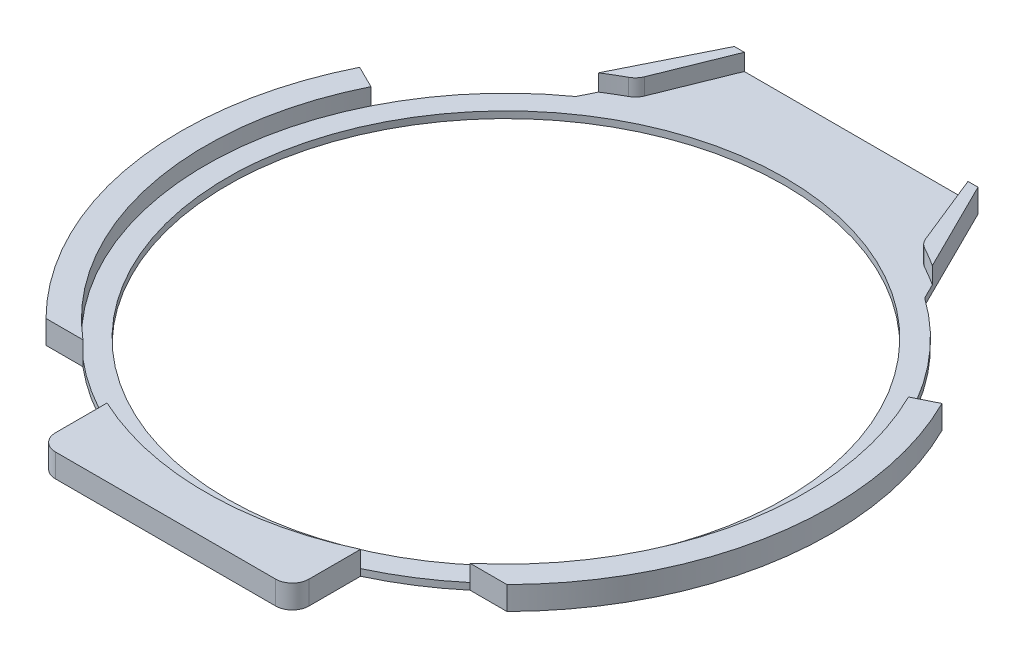
ISO-10303-21;
HEADER;
FILE_DESCRIPTION(('STEP AP214'),'2;1');
FILE_NAME('part.step','',(''),(''),'','','');
FILE_SCHEMA(('AUTOMOTIVE_DESIGN { 1 0 10303 214 1 1 1 1 }'));
ENDSEC;
DATA;
#1=APPLICATION_CONTEXT('core data for automotive mechanical design processes');
#2=APPLICATION_PROTOCOL_DEFINITION('international standard','automotive_design',2000,#1);
#3=PRODUCT_CONTEXT('',#1,'mechanical');
#4=PRODUCT('Part','Part','',(#3));
#5=PRODUCT_RELATED_PRODUCT_CATEGORY('part','',(#4));
#6=PRODUCT_DEFINITION_FORMATION('','',#4);
#7=PRODUCT_DEFINITION_CONTEXT('part definition',#1,'design');
#8=PRODUCT_DEFINITION('design','',#6,#7);
#9=PRODUCT_DEFINITION_SHAPE('','',#8);
#10=(LENGTH_UNIT() NAMED_UNIT(*) SI_UNIT(.MILLI.,.METRE.));
#11=(NAMED_UNIT(*) PLANE_ANGLE_UNIT() SI_UNIT($,.RADIAN.));
#12=(NAMED_UNIT(*) SI_UNIT($,.STERADIAN.) SOLID_ANGLE_UNIT());
#13=UNCERTAINTY_MEASURE_WITH_UNIT(LENGTH_MEASURE(1.E-05),#10,'distance_accuracy_value','');
#14=(GEOMETRIC_REPRESENTATION_CONTEXT(3) GLOBAL_UNCERTAINTY_ASSIGNED_CONTEXT((#13)) GLOBAL_UNIT_ASSIGNED_CONTEXT((#10,
#11,#12)) REPRESENTATION_CONTEXT('',''));
#15=CARTESIAN_POINT('',(0.,0.,0.));
#16=DIRECTION('',(0.,0.,1.));
#17=DIRECTION('',(1.,0.,0.));
#18=AXIS2_PLACEMENT_3D('',#15,#16,#17);
#19=CARTESIAN_POINT('',(0.,0.4,0.));
#20=DIRECTION('',(0.,-1.,0.));
#21=DIRECTION('',(0.,0.,-1.));
#22=AXIS2_PLACEMENT_3D('',#19,#20,#21);
#23=PLANE('',#22);
#24=CARTESIAN_POINT('',(0.,0.4,0.));
#25=DIRECTION('',(0.,1.,0.));
#26=DIRECTION('',(0.,0.,1.));
#27=AXIS2_PLACEMENT_3D('',#24,#25,#26);
#28=CIRCLE('',#27,16.7);
#29=CARTESIAN_POINT('',(0.,0.4,16.7));
#30=VERTEX_POINT('',#29);
#31=EDGE_CURVE('E337',#30,#30,#28,.T.);
#32=ORIENTED_EDGE('',*,*,#31,.F.);
#33=EDGE_LOOP('',(#32));
#34=FACE_BOUND('',#33,.T.);
#35=CARTESIAN_POINT('',(0.,0.4,0.));
#36=DIRECTION('',(0.,-1.,0.));
#37=DIRECTION('',(0.,0.,1.));
#38=AXIS2_PLACEMENT_3D('',#35,#36,#37);
#39=CIRCLE('',#38,18.);
#40=CARTESIAN_POINT('',(7.60000000000001,0.4,16.3168624434969));
#41=VERTEX_POINT('',#40);
#42=CARTESIAN_POINT('',(-7.6,0.4,16.3168624434969));
#43=VERTEX_POINT('',#42);
#44=EDGE_CURVE('E247',#41,#43,#39,.T.);
#45=ORIENTED_EDGE('',*,*,#44,.F.);
#46=CARTESIAN_POINT('',(0.,0.4,0.));
#47=DIRECTION('',(0.,1.,0.));
#48=DIRECTION('',(0.,0.,-1.));
#49=AXIS2_PLACEMENT_3D('',#46,#47,#48);
#50=CIRCLE('',#49,18.);
#51=CARTESIAN_POINT('',(11.606251108545,0.4,13.7584495930827));
#52=VERTEX_POINT('',#51);
#53=EDGE_CURVE('E357',#41,#52,#50,.T.);
#54=ORIENTED_EDGE('',*,*,#53,.T.);
#55=CARTESIAN_POINT('',(0.,0.4,0.));
#56=DIRECTION('',(0.,-1.,0.));
#57=DIRECTION('',(0.,0.,-1.));
#58=AXIS2_PLACEMENT_3D('',#55,#56,#57);
#59=CIRCLE('',#58,18.);
#60=CARTESIAN_POINT('',(16.1144925401185,0.4,-8.02017020857192));
#61=VERTEX_POINT('',#60);
#62=EDGE_CURVE('E251',#61,#52,#59,.T.);
#63=ORIENTED_EDGE('',*,*,#62,.F.);
#64=CARTESIAN_POINT('',(0.,0.4,0.));
#65=DIRECTION('',(0.,1.,0.));
#66=DIRECTION('',(0.,0.,-1.));
#67=AXIS2_PLACEMENT_3D('',#64,#65,#66);
#68=CIRCLE('',#67,18.);
#69=CARTESIAN_POINT('',(10.4617771668976,0.4,-14.6475669826146));
#70=VERTEX_POINT('',#69);
#71=EDGE_CURVE('E359',#61,#70,#68,.T.);
#72=ORIENTED_EDGE('',*,*,#71,.T.);
#73=DIRECTION('',(-0.44493731127233,0.,-0.895561717045648));
#74=VECTOR('',#73,1.);
#75=CARTESIAN_POINT('',(10.0092280551251,0.4,-15.5584495930827));
#76=LINE('',#75,#74);
#77=CARTESIAN_POINT('',(10.0092280551251,0.4,-15.5584495930827));
#78=VERTEX_POINT('',#77);
#79=EDGE_CURVE('E343',#70,#78,#76,.T.);
#80=ORIENTED_EDGE('',*,*,#79,.T.);
#81=CARTESIAN_POINT('',(0.,0.4,0.));
#82=DIRECTION('',(0.,-1.,0.));
#83=DIRECTION('',(0.,0.,1.));
#84=AXIS2_PLACEMENT_3D('',#81,#82,#83);
#85=CIRCLE('',#84,18.5);
#86=CARTESIAN_POINT('',(8.87292935243815,0.4,-16.2333337520868));
#87=VERTEX_POINT('',#86);
#88=EDGE_CURVE('E281',#87,#78,#85,.T.);
#89=ORIENTED_EDGE('',*,*,#88,.F.);
#90=CARTESIAN_POINT('',(9.35254715527264,0.4,-17.1108112521996));
#91=DIRECTION('',(0.,-1.,0.));
#92=DIRECTION('',(0.,0.,-1.));
#93=AXIS2_PLACEMENT_3D('',#90,#91,#92);
#94=CIRCLE('',#93,1.);
#95=CARTESIAN_POINT('',(8.42513285626354,0.4,-16.7367755346626));
#96=VERTEX_POINT('',#95);
#97=EDGE_CURVE('E41',#87,#96,#94,.T.);
#98=ORIENTED_EDGE('',*,*,#97,.T.);
#99=DIRECTION('',(0.374035717537045,0.,0.927414299009104));
#100=VECTOR('',#99,1.);
#101=CARTESIAN_POINT('',(8.56095789032979,0.4,-16.4));
#102=LINE('',#101,#100);
#103=CARTESIAN_POINT('',(6.70573061756858,0.4,-21.));
#104=VERTEX_POINT('',#103);
#105=EDGE_CURVE('E276',#104,#96,#102,.T.);
#106=ORIENTED_EDGE('',*,*,#105,.F.);
#107=DIRECTION('',(-1.,0.,0.));
#108=VECTOR('',#107,1.);
#109=CARTESIAN_POINT('',(-7.30573061756858,0.4,-21.));
#110=LINE('',#109,#108);
#111=CARTESIAN_POINT('',(-6.70573061756858,0.4,-21.));
#112=VERTEX_POINT('',#111);
#113=EDGE_CURVE('E346',#104,#112,#110,.T.);
#114=ORIENTED_EDGE('',*,*,#113,.T.);
#115=DIRECTION('',(0.374035717537046,0.,-0.927414299009104));
#116=VECTOR('',#115,1.);
#117=CARTESIAN_POINT('',(-8.5609578903298,0.4,-16.4));
#118=LINE('',#117,#116);
#119=CARTESIAN_POINT('',(-8.42513285626354,0.4,-16.7367755346626));
#120=VERTEX_POINT('',#119);
#121=EDGE_CURVE('E301',#120,#112,#118,.T.);
#122=ORIENTED_EDGE('',*,*,#121,.F.);
#123=CARTESIAN_POINT('',(-9.35254715527264,0.4,-17.1108112521996));
#124=DIRECTION('',(0.,-1.,0.));
#125=DIRECTION('',(0.,0.,-1.));
#126=AXIS2_PLACEMENT_3D('',#123,#124,#125);
#127=CIRCLE('',#126,1.);
#128=CARTESIAN_POINT('',(-8.87292935243815,0.4,-16.2333337520868));
#129=VERTEX_POINT('',#128);
#130=EDGE_CURVE('E11',#120,#129,#127,.T.);
#131=ORIENTED_EDGE('',*,*,#130,.T.);
#132=CARTESIAN_POINT('',(0.,0.4,0.));
#133=DIRECTION('',(0.,-1.,0.));
#134=DIRECTION('',(0.,0.,-1.));
#135=AXIS2_PLACEMENT_3D('',#132,#133,#134);
#136=CIRCLE('',#135,18.5);
#137=CARTESIAN_POINT('',(-10.0092280551251,0.4,-15.5584495930827));
#138=VERTEX_POINT('',#137);
#139=EDGE_CURVE('E297',#138,#129,#136,.T.);
#140=ORIENTED_EDGE('',*,*,#139,.F.);
#141=DIRECTION('',(-0.444937311272332,0.,0.895561717045647));
#142=VECTOR('',#141,1.);
#143=CARTESIAN_POINT('',(-7.30573061756858,0.4,-21.));
#144=LINE('',#143,#142);
#145=CARTESIAN_POINT('',(-10.4617771668976,0.4,-14.6475669826146));
#146=VERTEX_POINT('',#145);
#147=EDGE_CURVE('E350',#138,#146,#144,.T.);
#148=ORIENTED_EDGE('',*,*,#147,.T.);
#149=CARTESIAN_POINT('',(0.,0.4,0.));
#150=DIRECTION('',(0.,1.,0.));
#151=DIRECTION('',(0.,0.,1.));
#152=AXIS2_PLACEMENT_3D('',#149,#150,#151);
#153=CIRCLE('',#152,18.);
#154=CARTESIAN_POINT('',(-16.1144925401185,0.4,-8.02017020857191));
#155=VERTEX_POINT('',#154);
#156=EDGE_CURVE('E352',#146,#155,#153,.T.);
#157=ORIENTED_EDGE('',*,*,#156,.T.);
#158=CARTESIAN_POINT('',(0.,0.4,0.));
#159=DIRECTION('',(0.,-1.,0.));
#160=DIRECTION('',(0.,0.,1.));
#161=AXIS2_PLACEMENT_3D('',#158,#159,#160);
#162=CIRCLE('',#161,18.);
#163=CARTESIAN_POINT('',(-11.606251108545,0.4,13.7584495930827));
#164=VERTEX_POINT('',#163);
#165=EDGE_CURVE('E316',#164,#155,#162,.T.);
#166=ORIENTED_EDGE('',*,*,#165,.F.);
#167=CARTESIAN_POINT('',(0.,0.4,0.));
#168=DIRECTION('',(0.,1.,0.));
#169=DIRECTION('',(0.,0.,1.));
#170=AXIS2_PLACEMENT_3D('',#167,#168,#169);
#171=CIRCLE('',#170,18.);
#172=EDGE_CURVE('E355',#164,#43,#171,.T.);
#173=ORIENTED_EDGE('',*,*,#172,.T.);
#174=EDGE_LOOP('',(#45,#54,#63,#72,#80,#89,#98,#106,#114,#122,#131,#140,#148,#157,#166,#173));
#175=FACE_BOUND('',#174,.T.);
#176=ADVANCED_FACE('F33',(#34,#175),#23,.F.);
#177=CARTESIAN_POINT('',(0.,0.,0.));
#178=DIRECTION('',(0.,-1.,0.));
#179=DIRECTION('',(0.,0.,-1.));
#180=AXIS2_PLACEMENT_3D('',#177,#178,#179);
#181=PLANE('',#180);
#182=DIRECTION('',(0.,0.,-1.));
#183=VECTOR('',#182,1.);
#184=CARTESIAN_POINT('',(7.6,0.,20.4076999462));
#185=LINE('',#184,#183);
#186=CARTESIAN_POINT('',(7.6,0.,19.4076999462));
#187=VERTEX_POINT('',#186);
#188=CARTESIAN_POINT('',(7.6,0.,16.3168624434969));
#189=VERTEX_POINT('',#188);
#190=EDGE_CURVE('E383',#187,#189,#185,.T.);
#191=ORIENTED_EDGE('',*,*,#190,.F.);
#192=CARTESIAN_POINT('',(6.6,0.,19.4076999462));
#193=DIRECTION('',(0.,-1.,0.));
#194=DIRECTION('',(0.,0.,-1.));
#195=AXIS2_PLACEMENT_3D('',#192,#193,#194);
#196=CIRCLE('',#195,1.);
#197=CARTESIAN_POINT('',(6.6,0.,20.4076999462));
#198=VERTEX_POINT('',#197);
#199=EDGE_CURVE('E440',#187,#198,#196,.T.);
#200=ORIENTED_EDGE('',*,*,#199,.T.);
#201=DIRECTION('',(1.,0.,0.));
#202=VECTOR('',#201,1.);
#203=CARTESIAN_POINT('',(7.6,0.,20.4076999462));
#204=LINE('',#203,#202);
#205=CARTESIAN_POINT('',(-6.59999999999999,0.,20.4076999462));
#206=VERTEX_POINT('',#205);
#207=EDGE_CURVE('E380',#206,#198,#204,.T.);
#208=ORIENTED_EDGE('',*,*,#207,.F.);
#209=CARTESIAN_POINT('',(-6.59999999999999,0.,19.4076999462));
#210=DIRECTION('',(0.,-1.,0.));
#211=DIRECTION('',(0.,0.,-1.));
#212=AXIS2_PLACEMENT_3D('',#209,#210,#211);
#213=CIRCLE('',#212,1.);
#214=CARTESIAN_POINT('',(-7.6,0.,19.4076999462));
#215=VERTEX_POINT('',#214);
#216=EDGE_CURVE('E438',#206,#215,#213,.T.);
#217=ORIENTED_EDGE('',*,*,#216,.T.);
#218=DIRECTION('',(0.,0.,1.));
#219=VECTOR('',#218,1.);
#220=CARTESIAN_POINT('',(-7.6,0.,20.4076999462));
#221=LINE('',#220,#219);
#222=CARTESIAN_POINT('',(-7.6,0.,16.3168624434969));
#223=VERTEX_POINT('',#222);
#224=EDGE_CURVE('E378',#223,#215,#221,.T.);
#225=ORIENTED_EDGE('',*,*,#224,.F.);
#226=CARTESIAN_POINT('',(0.,0.,0.));
#227=DIRECTION('',(0.,1.,0.));
#228=DIRECTION('',(0.,0.,1.));
#229=AXIS2_PLACEMENT_3D('',#226,#227,#228);
#230=CIRCLE('',#229,18.);
#231=CARTESIAN_POINT('',(-11.606251108545,0.,13.7584495930827));
#232=VERTEX_POINT('',#231);
#233=EDGE_CURVE('E376',#232,#223,#230,.T.);
#234=ORIENTED_EDGE('',*,*,#233,.F.);
#235=DIRECTION('',(1.,0.,0.));
#236=VECTOR('',#235,1.);
#237=CARTESIAN_POINT('',(-13.8186491667819,0.,13.7584495930827));
#238=LINE('',#237,#236);
#239=CARTESIAN_POINT('',(-13.8186491667819,0.,13.7584495930827));
#240=VERTEX_POINT('',#239);
#241=EDGE_CURVE('E374',#240,#232,#238,.T.);
#242=ORIENTED_EDGE('',*,*,#241,.F.);
#243=CARTESIAN_POINT('',(0.,0.,0.));
#244=DIRECTION('',(0.,1.,0.));
#245=DIRECTION('',(0.,0.,1.));
#246=AXIS2_PLACEMENT_3D('',#243,#244,#245);
#247=CIRCLE('',#246,19.5);
#248=CARTESIAN_POINT('',(-17.4573669184617,0.,-8.6885177259529));
#249=VERTEX_POINT('',#248);
#250=EDGE_CURVE('E372',#249,#240,#247,.T.);
#251=ORIENTED_EDGE('',*,*,#250,.F.);
#252=DIRECTION('',(-0.895249585562142,0.,-0.445565011587325));
#253=VECTOR('',#252,1.);
#254=CARTESIAN_POINT('',(-16.1144925401185,0.,-8.02017020857191));
#255=LINE('',#254,#253);
#256=CARTESIAN_POINT('',(-16.1144925401185,0.,-8.02017020857191));
#257=VERTEX_POINT('',#256);
#258=EDGE_CURVE('E370',#257,#249,#255,.T.);
#259=ORIENTED_EDGE('',*,*,#258,.F.);
#260=CARTESIAN_POINT('',(0.,0.,0.));
#261=DIRECTION('',(0.,1.,0.));
#262=DIRECTION('',(0.,0.,1.));
#263=AXIS2_PLACEMENT_3D('',#260,#261,#262);
#264=CIRCLE('',#263,18.);
#265=CARTESIAN_POINT('',(-10.4617771668976,0.,-14.6475669826146));
#266=VERTEX_POINT('',#265);
#267=EDGE_CURVE('E368',#266,#257,#264,.T.);
#268=ORIENTED_EDGE('',*,*,#267,.F.);
#269=DIRECTION('',(-0.44493731127233,0.,0.895561717045648));
#270=VECTOR('',#269,1.);
#271=CARTESIAN_POINT('',(-10.0092280551251,0.,-15.5584495930827));
#272=LINE('',#271,#270);
#273=CARTESIAN_POINT('',(-7.30573061756858,0.,-21.));
#274=VERTEX_POINT('',#273);
#275=EDGE_CURVE('E366',#274,#266,#272,.T.);
#276=ORIENTED_EDGE('',*,*,#275,.F.);
#277=DIRECTION('',(-1.,0.,0.));
#278=VECTOR('',#277,1.);
#279=CARTESIAN_POINT('',(-7.30573061756858,0.,-21.));
#280=LINE('',#279,#278);
#281=CARTESIAN_POINT('',(7.30573061756858,0.,-21.));
#282=VERTEX_POINT('',#281);
#283=EDGE_CURVE('E363',#282,#274,#280,.T.);
#284=ORIENTED_EDGE('',*,*,#283,.F.);
#285=DIRECTION('',(-0.444937311272332,0.,-0.895561717045647));
#286=VECTOR('',#285,1.);
#287=CARTESIAN_POINT('',(7.30573061756858,0.,-21.));
#288=LINE('',#287,#286);
#289=CARTESIAN_POINT('',(10.4617771668976,0.,-14.6475669826146));
#290=VERTEX_POINT('',#289);
#291=EDGE_CURVE('E340',#290,#282,#288,.T.);
#292=ORIENTED_EDGE('',*,*,#291,.F.);
#293=CARTESIAN_POINT('',(0.,0.,0.));
#294=DIRECTION('',(0.,1.,0.));
#295=DIRECTION('',(0.,0.,-1.));
#296=AXIS2_PLACEMENT_3D('',#293,#294,#295);
#297=CIRCLE('',#296,18.);
#298=CARTESIAN_POINT('',(16.1144925401185,0.,-8.02017020857191));
#299=VERTEX_POINT('',#298);
#300=EDGE_CURVE('E347',#299,#290,#297,.T.);
#301=ORIENTED_EDGE('',*,*,#300,.F.);
#302=DIRECTION('',(-0.895249585562142,0.,0.445565011587325));
#303=VECTOR('',#302,1.);
#304=CARTESIAN_POINT('',(16.1144925401185,0.,-8.02017020857191));
#305=LINE('',#304,#303);
#306=CARTESIAN_POINT('',(17.4573669184617,0.,-8.6885177259529));
#307=VERTEX_POINT('',#306);
#308=EDGE_CURVE('E391',#307,#299,#305,.T.);
#309=ORIENTED_EDGE('',*,*,#308,.F.);
#310=CARTESIAN_POINT('',(0.,0.,0.));
#311=DIRECTION('',(0.,1.,0.));
#312=DIRECTION('',(0.,0.,-1.));
#313=AXIS2_PLACEMENT_3D('',#310,#311,#312);
#314=CIRCLE('',#313,19.5);
#315=CARTESIAN_POINT('',(13.8186491667819,0.,13.7584495930827));
#316=VERTEX_POINT('',#315);
#317=EDGE_CURVE('E389',#316,#307,#314,.T.);
#318=ORIENTED_EDGE('',*,*,#317,.F.);
#319=DIRECTION('',(1.,0.,0.));
#320=VECTOR('',#319,1.);
#321=CARTESIAN_POINT('',(13.8186491667819,0.,13.7584495930827));
#322=LINE('',#321,#320);
#323=CARTESIAN_POINT('',(11.606251108545,0.,13.7584495930827));
#324=VERTEX_POINT('',#323);
#325=EDGE_CURVE('E387',#324,#316,#322,.T.);
#326=ORIENTED_EDGE('',*,*,#325,.F.);
#327=CARTESIAN_POINT('',(0.,0.,0.));
#328=DIRECTION('',(0.,1.,0.));
#329=DIRECTION('',(0.,0.,-1.));
#330=AXIS2_PLACEMENT_3D('',#327,#328,#329);
#331=CIRCLE('',#330,18.);
#332=EDGE_CURVE('E385',#189,#324,#331,.T.);
#333=ORIENTED_EDGE('',*,*,#332,.F.);
#334=EDGE_LOOP('',(#191,#200,#208,#217,#225,#234,#242,#251,#259,#268,#276,#284,#292,#301,#309,
#318,#326,#333));
#335=FACE_BOUND('',#334,.T.);
#336=CARTESIAN_POINT('',(0.,0.,0.));
#337=DIRECTION('',(0.,1.,0.));
#338=DIRECTION('',(0.,0.,1.));
#339=AXIS2_PLACEMENT_3D('',#336,#337,#338);
#340=CIRCLE('',#339,16.7);
#341=CARTESIAN_POINT('',(0.,0.,16.7));
#342=VERTEX_POINT('',#341);
#343=EDGE_CURVE('E336',#342,#342,#340,.T.);
#344=ORIENTED_EDGE('',*,*,#343,.T.);
#345=EDGE_LOOP('',(#344));
#346=FACE_BOUND('',#345,.T.);
#347=ADVANCED_FACE('F536',(#335,#346),#181,.T.);
#348=CARTESIAN_POINT('',(7.30573061756858,0.4,-21.));
#349=DIRECTION('',(-0.895561717045647,0.,0.444937311272332));
#350=DIRECTION('',(0.444937311272332,0.,0.895561717045647));
#351=AXIS2_PLACEMENT_3D('',#348,#349,#350);
#352=PLANE('',#351);
#353=ORIENTED_EDGE('',*,*,#291,.T.);
#354=DIRECTION('',(0.,-1.,0.));
#355=VECTOR('',#354,1.);
#356=CARTESIAN_POINT('',(7.30573061756858,0.4,-21.));
#357=LINE('',#356,#355);
#358=CARTESIAN_POINT('',(7.30573061756858,1.4,-21.));
#359=VERTEX_POINT('',#358);
#360=EDGE_CURVE('E432',#359,#282,#357,.T.);
#361=ORIENTED_EDGE('',*,*,#360,.F.);
#362=DIRECTION('',(-0.444937311272332,0.,-0.895561717045647));
#363=VECTOR('',#362,1.);
#364=CARTESIAN_POINT('',(10.0092280551251,1.4,-15.5584495930827));
#365=LINE('',#364,#363);
#366=CARTESIAN_POINT('',(10.0092280551251,1.4,-15.5584495930827));
#367=VERTEX_POINT('',#366);
#368=EDGE_CURVE('E277',#367,#359,#365,.T.);
#369=ORIENTED_EDGE('',*,*,#368,.F.);
#370=DIRECTION('',(0.,-1.,0.));
#371=VECTOR('',#370,1.);
#372=CARTESIAN_POINT('',(10.0092280551251,1.4,-15.5584495930827));
#373=LINE('',#372,#371);
#374=EDGE_CURVE('E288',#367,#78,#373,.T.);
#375=ORIENTED_EDGE('',*,*,#374,.T.);
#376=ORIENTED_EDGE('',*,*,#79,.F.);
#377=DIRECTION('',(0.,-1.,0.));
#378=VECTOR('',#377,1.);
#379=CARTESIAN_POINT('',(10.4617771668976,0.4,-14.6475669826146));
#380=LINE('',#379,#378);
#381=EDGE_CURVE('E361',#70,#290,#380,.T.);
#382=ORIENTED_EDGE('',*,*,#381,.T.);
#383=EDGE_LOOP('',(#353,#361,#369,#375,#376,#382));
#384=FACE_BOUND('',#383,.T.);
#385=ADVANCED_FACE('F484',(#384),#352,.F.);
#386=CARTESIAN_POINT('',(-7.30573061756858,0.4,-21.));
#387=DIRECTION('',(0.,0.,1.));
#388=DIRECTION('',(1.,0.,0.));
#389=AXIS2_PLACEMENT_3D('',#386,#387,#388);
#390=PLANE('',#389);
#391=ORIENTED_EDGE('',*,*,#283,.T.);
#392=DIRECTION('',(0.,-1.,0.));
#393=VECTOR('',#392,1.);
#394=CARTESIAN_POINT('',(-7.30573061756858,0.4,-21.));
#395=LINE('',#394,#393);
#396=CARTESIAN_POINT('',(-7.30573061756858,1.4,-21.));
#397=VERTEX_POINT('',#396);
#398=EDGE_CURVE('E429',#397,#274,#395,.T.);
#399=ORIENTED_EDGE('',*,*,#398,.F.);
#400=DIRECTION('',(-1.,0.,0.));
#401=VECTOR('',#400,1.);
#402=CARTESIAN_POINT('',(-7.30573061756858,1.4,-21.));
#403=LINE('',#402,#401);
#404=CARTESIAN_POINT('',(-6.70573061756858,1.4,-21.));
#405=VERTEX_POINT('',#404);
#406=EDGE_CURVE('E303',#405,#397,#403,.T.);
#407=ORIENTED_EDGE('',*,*,#406,.F.);
#408=DIRECTION('',(0.,-1.,0.));
#409=VECTOR('',#408,1.);
#410=CARTESIAN_POINT('',(-6.70573061756858,1.4,-21.));
#411=LINE('',#410,#409);
#412=EDGE_CURVE('E313',#405,#112,#411,.T.);
#413=ORIENTED_EDGE('',*,*,#412,.T.);
#414=ORIENTED_EDGE('',*,*,#113,.F.);
#415=DIRECTION('',(0.,-1.,0.));
#416=VECTOR('',#415,1.);
#417=CARTESIAN_POINT('',(6.70573061756858,1.4,-21.));
#418=LINE('',#417,#416);
#419=CARTESIAN_POINT('',(6.70573061756858,1.4,-21.));
#420=VERTEX_POINT('',#419);
#421=EDGE_CURVE('E294',#420,#104,#418,.T.);
#422=ORIENTED_EDGE('',*,*,#421,.F.);
#423=DIRECTION('',(-1.,0.,0.));
#424=VECTOR('',#423,1.);
#425=CARTESIAN_POINT('',(6.70573061756858,1.4,-21.));
#426=LINE('',#425,#424);
#427=EDGE_CURVE('E280',#359,#420,#426,.T.);
#428=ORIENTED_EDGE('',*,*,#427,.F.);
#429=ORIENTED_EDGE('',*,*,#360,.T.);
#430=EDGE_LOOP('',(#391,#399,#407,#413,#414,#422,#428,#429));
#431=FACE_BOUND('',#430,.T.);
#432=ADVANCED_FACE('F487',(#431),#390,.F.);
#433=CARTESIAN_POINT('',(-10.0092280551251,0.4,-15.5584495930827));
#434=DIRECTION('',(0.895561717045648,0.,0.44493731127233));
#435=DIRECTION('',(0.44493731127233,0.,-0.895561717045648));
#436=AXIS2_PLACEMENT_3D('',#433,#434,#435);
#437=PLANE('',#436);
#438=ORIENTED_EDGE('',*,*,#275,.T.);
#439=DIRECTION('',(0.,-1.,0.));
#440=VECTOR('',#439,1.);
#441=CARTESIAN_POINT('',(-10.4617771668976,0.4,-14.6475669826146));
#442=LINE('',#441,#440);
#443=EDGE_CURVE('E426',#146,#266,#442,.T.);
#444=ORIENTED_EDGE('',*,*,#443,.F.);
#445=ORIENTED_EDGE('',*,*,#147,.F.);
#446=DIRECTION('',(0.,-1.,0.));
#447=VECTOR('',#446,1.);
#448=CARTESIAN_POINT('',(-10.0092280551251,1.4,-15.5584495930827));
#449=LINE('',#448,#447);
#450=CARTESIAN_POINT('',(-10.0092280551251,1.4,-15.5584495930827));
#451=VERTEX_POINT('',#450);
#452=EDGE_CURVE('E308',#451,#138,#449,.T.);
#453=ORIENTED_EDGE('',*,*,#452,.F.);
#454=DIRECTION('',(-0.444937311272332,0.,0.895561717045647));
#455=VECTOR('',#454,1.);
#456=CARTESIAN_POINT('',(-7.30573061756858,1.4,-21.));
#457=LINE('',#456,#455);
#458=EDGE_CURVE('E306',#397,#451,#457,.T.);
#459=ORIENTED_EDGE('',*,*,#458,.F.);
#460=ORIENTED_EDGE('',*,*,#398,.T.);
#461=EDGE_LOOP('',(#438,#444,#445,#453,#459,#460));
#462=FACE_BOUND('',#461,.T.);
#463=ADVANCED_FACE('F502',(#462),#437,.F.);
#464=CARTESIAN_POINT('',(0.,0.4,0.));
#465=DIRECTION('',(0.,-1.,0.));
#466=DIRECTION('',(0.,0.,-1.));
#467=AXIS2_PLACEMENT_3D('',#464,#465,#466);
#468=CYLINDRICAL_SURFACE('',#467,18.);
#469=ORIENTED_EDGE('',*,*,#267,.T.);
#470=DIRECTION('',(0.,-1.,0.));
#471=VECTOR('',#470,1.);
#472=CARTESIAN_POINT('',(-16.1144925401185,0.4,-8.02017020857191));
#473=LINE('',#472,#471);
#474=EDGE_CURVE('E423',#155,#257,#473,.T.);
#475=ORIENTED_EDGE('',*,*,#474,.F.);
#476=ORIENTED_EDGE('',*,*,#156,.F.);
#477=ORIENTED_EDGE('',*,*,#443,.T.);
#478=EDGE_LOOP('',(#469,#475,#476,#477));
#479=FACE_BOUND('',#478,.T.);
#480=ADVANCED_FACE('F562',(#479),#468,.T.);
#481=CARTESIAN_POINT('',(-16.1144925401185,0.4,-8.02017020857191));
#482=DIRECTION('',(-0.445565011587325,0.,0.895249585562142));
#483=DIRECTION('',(0.895249585562142,0.,0.445565011587325));
#484=AXIS2_PLACEMENT_3D('',#481,#482,#483);
#485=PLANE('',#484);
#486=ORIENTED_EDGE('',*,*,#258,.T.);
#487=DIRECTION('',(0.,-1.,0.));
#488=VECTOR('',#487,1.);
#489=CARTESIAN_POINT('',(-17.4573669184617,0.4,-8.6885177259529));
#490=LINE('',#489,#488);
#491=CARTESIAN_POINT('',(-17.4573669184617,1.4,-8.6885177259529));
#492=VERTEX_POINT('',#491);
#493=EDGE_CURVE('E420',#492,#249,#490,.T.);
#494=ORIENTED_EDGE('',*,*,#493,.F.);
#495=DIRECTION('',(-0.895249585562142,0.,-0.445565011587325));
#496=VECTOR('',#495,1.);
#497=CARTESIAN_POINT('',(-16.1144925401185,1.4,-8.02017020857191));
#498=LINE('',#497,#496);
#499=CARTESIAN_POINT('',(-16.1144925401185,1.4,-8.02017020857191));
#500=VERTEX_POINT('',#499);
#501=EDGE_CURVE('E320',#500,#492,#498,.T.);
#502=ORIENTED_EDGE('',*,*,#501,.F.);
#503=DIRECTION('',(0.,-1.,0.));
#504=VECTOR('',#503,1.);
#505=CARTESIAN_POINT('',(-16.1144925401185,1.4,-8.02017020857191));
#506=LINE('',#505,#504);
#507=EDGE_CURVE('E333',#500,#155,#506,.T.);
#508=ORIENTED_EDGE('',*,*,#507,.T.);
#509=ORIENTED_EDGE('',*,*,#474,.T.);
#510=EDGE_LOOP('',(#486,#494,#502,#508,#509));
#511=FACE_BOUND('',#510,.T.);
#512=ADVANCED_FACE('F509',(#511),#485,.F.);
#513=CARTESIAN_POINT('',(0.,0.4,0.));
#514=DIRECTION('',(0.,-1.,0.));
#515=DIRECTION('',(0.,0.,-1.));
#516=AXIS2_PLACEMENT_3D('',#513,#514,#515);
#517=CYLINDRICAL_SURFACE('',#516,19.5);
#518=ORIENTED_EDGE('',*,*,#250,.T.);
#519=DIRECTION('',(0.,-1.,0.));
#520=VECTOR('',#519,1.);
#521=CARTESIAN_POINT('',(-13.8186491667819,0.4,13.7584495930827));
#522=LINE('',#521,#520);
#523=CARTESIAN_POINT('',(-13.8186491667819,1.4,13.7584495930827));
#524=VERTEX_POINT('',#523);
#525=EDGE_CURVE('E417',#524,#240,#522,.T.);
#526=ORIENTED_EDGE('',*,*,#525,.F.);
#527=CARTESIAN_POINT('',(0.,1.4,0.));
#528=DIRECTION('',(0.,1.,0.));
#529=DIRECTION('',(0.,0.,1.));
#530=AXIS2_PLACEMENT_3D('',#527,#528,#529);
#531=CIRCLE('',#530,19.5);
#532=EDGE_CURVE('E323',#492,#524,#531,.T.);
#533=ORIENTED_EDGE('',*,*,#532,.F.);
#534=ORIENTED_EDGE('',*,*,#493,.T.);
#535=EDGE_LOOP('',(#518,#526,#533,#534));
#536=FACE_BOUND('',#535,.T.);
#537=ADVANCED_FACE('F569',(#536),#517,.T.);
#538=CARTESIAN_POINT('',(-13.8186491667819,0.4,13.7584495930827));
#539=DIRECTION('',(0.,0.,-1.));
#540=DIRECTION('',(-1.,0.,0.));
#541=AXIS2_PLACEMENT_3D('',#538,#539,#540);
#542=PLANE('',#541);
#543=ORIENTED_EDGE('',*,*,#241,.T.);
#544=DIRECTION('',(0.,-1.,0.));
#545=VECTOR('',#544,1.);
#546=CARTESIAN_POINT('',(-11.606251108545,0.4,13.7584495930827));
#547=LINE('',#546,#545);
#548=EDGE_CURVE('E414',#164,#232,#547,.T.);
#549=ORIENTED_EDGE('',*,*,#548,.F.);
#550=DIRECTION('',(0.,-1.,0.));
#551=VECTOR('',#550,1.);
#552=CARTESIAN_POINT('',(-11.606251108545,1.4,13.7584495930827));
#553=LINE('',#552,#551);
#554=CARTESIAN_POINT('',(-11.606251108545,1.4,13.7584495930827));
#555=VERTEX_POINT('',#554);
#556=EDGE_CURVE('E328',#555,#164,#553,.T.);
#557=ORIENTED_EDGE('',*,*,#556,.F.);
#558=DIRECTION('',(1.,0.,0.));
#559=VECTOR('',#558,1.);
#560=CARTESIAN_POINT('',(-13.8186491667819,1.4,13.7584495930827));
#561=LINE('',#560,#559);
#562=EDGE_CURVE('E326',#524,#555,#561,.T.);
#563=ORIENTED_EDGE('',*,*,#562,.F.);
#564=ORIENTED_EDGE('',*,*,#525,.T.);
#565=EDGE_LOOP('',(#543,#549,#557,#563,#564));
#566=FACE_BOUND('',#565,.T.);
#567=ADVANCED_FACE('F517',(#566),#542,.F.);
#568=CARTESIAN_POINT('',(0.,0.4,0.));
#569=DIRECTION('',(0.,-1.,0.));
#570=DIRECTION('',(0.,0.,-1.));
#571=AXIS2_PLACEMENT_3D('',#568,#569,#570);
#572=CYLINDRICAL_SURFACE('',#571,18.);
#573=ORIENTED_EDGE('',*,*,#233,.T.);
#574=DIRECTION('',(0.,-1.,0.));
#575=VECTOR('',#574,1.);
#576=CARTESIAN_POINT('',(-7.6,0.4,16.3168624434969));
#577=LINE('',#576,#575);
#578=EDGE_CURVE('E412',#43,#223,#577,.T.);
#579=ORIENTED_EDGE('',*,*,#578,.F.);
#580=ORIENTED_EDGE('',*,*,#172,.F.);
#581=ORIENTED_EDGE('',*,*,#548,.T.);
#582=EDGE_LOOP('',(#573,#579,#580,#581));
#583=FACE_BOUND('',#582,.T.);
#584=ADVANCED_FACE('F523',(#583),#572,.T.);
#585=CARTESIAN_POINT('',(-7.6,0.4,20.4076999462));
#586=DIRECTION('',(1.,0.,0.));
#587=DIRECTION('',(0.,0.,-1.));
#588=AXIS2_PLACEMENT_3D('',#585,#586,#587);
#589=PLANE('',#588);
#590=ORIENTED_EDGE('',*,*,#224,.T.);
#591=DIRECTION('',(0.,-1.,0.));
#592=VECTOR('',#591,1.);
#593=CARTESIAN_POINT('',(-7.6,0.4,19.4076999462));
#594=LINE('',#593,#592);
#595=CARTESIAN_POINT('',(-7.6,1.4,19.4076999462));
#596=VERTEX_POINT('',#595);
#597=EDGE_CURVE('E233',#215,#596,#594,.F.);
#598=ORIENTED_EDGE('',*,*,#597,.T.);
#599=DIRECTION('',(0.,0.,1.));
#600=VECTOR('',#599,1.);
#601=CARTESIAN_POINT('',(-7.6,1.4,16.3168624434969));
#602=LINE('',#601,#600);
#603=CARTESIAN_POINT('',(-7.6,1.4,16.3168624434969));
#604=VERTEX_POINT('',#603);
#605=EDGE_CURVE('E224',#604,#596,#602,.T.);
#606=ORIENTED_EDGE('',*,*,#605,.F.);
#607=DIRECTION('',(0.,-1.,0.));
#608=VECTOR('',#607,1.);
#609=CARTESIAN_POINT('',(-7.6,1.4,16.3168624434969));
#610=LINE('',#609,#608);
#611=EDGE_CURVE('E230',#604,#43,#610,.T.);
#612=ORIENTED_EDGE('',*,*,#611,.T.);
#613=ORIENTED_EDGE('',*,*,#578,.T.);
#614=EDGE_LOOP('',(#590,#598,#606,#612,#613));
#615=FACE_BOUND('',#614,.T.);
#616=ADVANCED_FACE('F227',(#615),#589,.F.);
#617=CARTESIAN_POINT('',(7.6,0.4,20.4076999462));
#618=DIRECTION('',(0.,0.,-1.));
#619=DIRECTION('',(-1.,0.,0.));
#620=AXIS2_PLACEMENT_3D('',#617,#618,#619);
#621=PLANE('',#620);
#622=ORIENTED_EDGE('',*,*,#207,.T.);
#623=DIRECTION('',(0.,-1.,0.));
#624=VECTOR('',#623,1.);
#625=CARTESIAN_POINT('',(6.6,0.4,20.4076999462));
#626=LINE('',#625,#624);
#627=CARTESIAN_POINT('',(6.6,1.4,20.4076999462));
#628=VERTEX_POINT('',#627);
#629=EDGE_CURVE('E445',#198,#628,#626,.F.);
#630=ORIENTED_EDGE('',*,*,#629,.T.);
#631=DIRECTION('',(1.,0.,0.));
#632=VECTOR('',#631,1.);
#633=CARTESIAN_POINT('',(-7.6,1.4,20.4076999462));
#634=LINE('',#633,#632);
#635=CARTESIAN_POINT('',(-6.59999999999999,1.4,20.4076999462));
#636=VERTEX_POINT('',#635);
#637=EDGE_CURVE('E236',#636,#628,#634,.T.);
#638=ORIENTED_EDGE('',*,*,#637,.F.);
#639=DIRECTION('',(0.,-1.,0.));
#640=VECTOR('',#639,1.);
#641=CARTESIAN_POINT('',(-6.59999999999999,0.4,20.4076999462));
#642=LINE('',#641,#640);
#643=EDGE_CURVE('E442',#636,#206,#642,.T.);
#644=ORIENTED_EDGE('',*,*,#643,.T.);
#645=EDGE_LOOP('',(#622,#630,#638,#644));
#646=FACE_BOUND('',#645,.T.);
#647=ADVANCED_FACE('F596',(#646),#621,.F.);
#648=CARTESIAN_POINT('',(7.6,0.4,20.4076999462));
#649=DIRECTION('',(-1.,0.,0.));
#650=DIRECTION('',(0.,0.,1.));
#651=AXIS2_PLACEMENT_3D('',#648,#649,#650);
#652=PLANE('',#651);
#653=DIRECTION('',(0.,0.,-1.));
#654=VECTOR('',#653,1.);
#655=CARTESIAN_POINT('',(7.6,1.4,20.4076999462));
#656=LINE('',#655,#654);
#657=CARTESIAN_POINT('',(7.60000000000001,1.4,19.4076999462));
#658=VERTEX_POINT('',#657);
#659=CARTESIAN_POINT('',(7.60000000000001,1.4,16.3168624434969));
#660=VERTEX_POINT('',#659);
#661=EDGE_CURVE('E243',#658,#660,#656,.T.);
#662=ORIENTED_EDGE('',*,*,#661,.F.);
#663=DIRECTION('',(0.,-1.,0.));
#664=VECTOR('',#663,1.);
#665=CARTESIAN_POINT('',(7.6,0.4,19.4076999462));
#666=LINE('',#665,#664);
#667=EDGE_CURVE('E435',#658,#187,#666,.T.);
#668=ORIENTED_EDGE('',*,*,#667,.T.);
#669=ORIENTED_EDGE('',*,*,#190,.T.);
#670=DIRECTION('',(0.,-1.,0.));
#671=VECTOR('',#670,1.);
#672=CARTESIAN_POINT('',(7.6,0.4,16.3168624434969));
#673=LINE('',#672,#671);
#674=EDGE_CURVE('E409',#41,#189,#673,.T.);
#675=ORIENTED_EDGE('',*,*,#674,.F.);
#676=DIRECTION('',(0.,-1.,0.));
#677=VECTOR('',#676,1.);
#678=CARTESIAN_POINT('',(7.60000000000001,1.4,16.3168624434969));
#679=LINE('',#678,#677);
#680=EDGE_CURVE('E252',#660,#41,#679,.T.);
#681=ORIENTED_EDGE('',*,*,#680,.F.);
#682=EDGE_LOOP('',(#662,#668,#669,#675,#681));
#683=FACE_BOUND('',#682,.T.);
#684=ADVANCED_FACE('F528',(#683),#652,.F.);
#685=CARTESIAN_POINT('',(0.,0.4,0.));
#686=DIRECTION('',(0.,-1.,0.));
#687=DIRECTION('',(0.,0.,-1.));
#688=AXIS2_PLACEMENT_3D('',#685,#686,#687);
#689=CYLINDRICAL_SURFACE('',#688,18.);
#690=ORIENTED_EDGE('',*,*,#332,.T.);
#691=DIRECTION('',(0.,-1.,0.));
#692=VECTOR('',#691,1.);
#693=CARTESIAN_POINT('',(11.606251108545,0.4,13.7584495930827));
#694=LINE('',#693,#692);
#695=EDGE_CURVE('E406',#52,#324,#694,.T.);
#696=ORIENTED_EDGE('',*,*,#695,.F.);
#697=ORIENTED_EDGE('',*,*,#53,.F.);
#698=ORIENTED_EDGE('',*,*,#674,.T.);
#699=EDGE_LOOP('',(#690,#696,#697,#698));
#700=FACE_BOUND('',#699,.T.);
#701=ADVANCED_FACE('F533',(#700),#689,.T.);
#702=CARTESIAN_POINT('',(13.8186491667819,0.4,13.7584495930827));
#703=DIRECTION('',(0.,0.,-1.));
#704=DIRECTION('',(-1.,0.,0.));
#705=AXIS2_PLACEMENT_3D('',#702,#703,#704);
#706=PLANE('',#705);
#707=ORIENTED_EDGE('',*,*,#325,.T.);
#708=DIRECTION('',(0.,-1.,0.));
#709=VECTOR('',#708,1.);
#710=CARTESIAN_POINT('',(13.8186491667819,0.4,13.7584495930827));
#711=LINE('',#710,#709);
#712=CARTESIAN_POINT('',(13.8186491667819,1.4,13.7584495930827));
#713=VERTEX_POINT('',#712);
#714=EDGE_CURVE('E403',#713,#316,#711,.T.);
#715=ORIENTED_EDGE('',*,*,#714,.F.);
#716=DIRECTION('',(1.,0.,0.));
#717=VECTOR('',#716,1.);
#718=CARTESIAN_POINT('',(11.606251108545,1.4,13.7584495930827));
#719=LINE('',#718,#717);
#720=CARTESIAN_POINT('',(11.606251108545,1.4,13.7584495930827));
#721=VERTEX_POINT('',#720);
#722=EDGE_CURVE('E262',#721,#713,#719,.T.);
#723=ORIENTED_EDGE('',*,*,#722,.F.);
#724=DIRECTION('',(0.,-1.,0.));
#725=VECTOR('',#724,1.);
#726=CARTESIAN_POINT('',(11.606251108545,1.4,13.7584495930827));
#727=LINE('',#726,#725);
#728=EDGE_CURVE('E273',#721,#52,#727,.T.);
#729=ORIENTED_EDGE('',*,*,#728,.T.);
#730=ORIENTED_EDGE('',*,*,#695,.T.);
#731=EDGE_LOOP('',(#707,#715,#723,#729,#730));
#732=FACE_BOUND('',#731,.T.);
#733=ADVANCED_FACE('F541',(#732),#706,.F.);
#734=CARTESIAN_POINT('',(0.,0.4,0.));
#735=DIRECTION('',(0.,-1.,0.));
#736=DIRECTION('',(0.,0.,-1.));
#737=AXIS2_PLACEMENT_3D('',#734,#735,#736);
#738=CYLINDRICAL_SURFACE('',#737,19.5);
#739=ORIENTED_EDGE('',*,*,#317,.T.);
#740=DIRECTION('',(0.,-1.,0.));
#741=VECTOR('',#740,1.);
#742=CARTESIAN_POINT('',(17.4573669184617,0.4,-8.6885177259529));
#743=LINE('',#742,#741);
#744=CARTESIAN_POINT('',(17.4573669184617,1.4,-8.68851772595291));
#745=VERTEX_POINT('',#744);
#746=EDGE_CURVE('E400',#745,#307,#743,.T.);
#747=ORIENTED_EDGE('',*,*,#746,.F.);
#748=CARTESIAN_POINT('',(0.,1.4,0.));
#749=DIRECTION('',(0.,1.,0.));
#750=DIRECTION('',(0.,0.,1.));
#751=AXIS2_PLACEMENT_3D('',#748,#749,#750);
#752=CIRCLE('',#751,19.5);
#753=EDGE_CURVE('E265',#713,#745,#752,.T.);
#754=ORIENTED_EDGE('',*,*,#753,.F.);
#755=ORIENTED_EDGE('',*,*,#714,.T.);
#756=EDGE_LOOP('',(#739,#747,#754,#755));
#757=FACE_BOUND('',#756,.T.);
#758=ADVANCED_FACE('F544',(#757),#738,.T.);
#759=CARTESIAN_POINT('',(16.1144925401185,0.4,-8.02017020857191));
#760=DIRECTION('',(0.445565011587325,0.,0.895249585562142));
#761=DIRECTION('',(0.895249585562142,0.,-0.445565011587325));
#762=AXIS2_PLACEMENT_3D('',#759,#760,#761);
#763=PLANE('',#762);
#764=ORIENTED_EDGE('',*,*,#308,.T.);
#765=DIRECTION('',(0.,-1.,0.));
#766=VECTOR('',#765,1.);
#767=CARTESIAN_POINT('',(16.1144925401185,0.4,-8.02017020857191));
#768=LINE('',#767,#766);
#769=EDGE_CURVE('E397',#61,#299,#768,.T.);
#770=ORIENTED_EDGE('',*,*,#769,.F.);
#771=DIRECTION('',(0.,-1.,0.));
#772=VECTOR('',#771,1.);
#773=CARTESIAN_POINT('',(16.1144925401185,1.4,-8.02017020857192));
#774=LINE('',#773,#772);
#775=CARTESIAN_POINT('',(16.1144925401185,1.4,-8.02017020857192));
#776=VERTEX_POINT('',#775);
#777=EDGE_CURVE('E269',#776,#61,#774,.T.);
#778=ORIENTED_EDGE('',*,*,#777,.F.);
#779=DIRECTION('',(-0.895249585562141,0.,0.445565011587327));
#780=VECTOR('',#779,1.);
#781=CARTESIAN_POINT('',(17.4573669184617,1.4,-8.68851772595291));
#782=LINE('',#781,#780);
#783=EDGE_CURVE('E268',#745,#776,#782,.T.);
#784=ORIENTED_EDGE('',*,*,#783,.F.);
#785=ORIENTED_EDGE('',*,*,#746,.T.);
#786=EDGE_LOOP('',(#764,#770,#778,#784,#785));
#787=FACE_BOUND('',#786,.T.);
#788=ADVANCED_FACE('F550',(#787),#763,.F.);
#789=CARTESIAN_POINT('',(0.,0.4,0.));
#790=DIRECTION('',(0.,-1.,0.));
#791=DIRECTION('',(0.,0.,-1.));
#792=AXIS2_PLACEMENT_3D('',#789,#790,#791);
#793=CYLINDRICAL_SURFACE('',#792,18.);
#794=ORIENTED_EDGE('',*,*,#300,.T.);
#795=ORIENTED_EDGE('',*,*,#381,.F.);
#796=ORIENTED_EDGE('',*,*,#71,.F.);
#797=ORIENTED_EDGE('',*,*,#769,.T.);
#798=EDGE_LOOP('',(#794,#795,#796,#797));
#799=FACE_BOUND('',#798,.T.);
#800=ADVANCED_FACE('F558',(#799),#793,.T.);
#801=CARTESIAN_POINT('',(0.,0.4,0.));
#802=DIRECTION('',(0.,-1.,0.));
#803=DIRECTION('',(0.,0.,-1.));
#804=AXIS2_PLACEMENT_3D('',#801,#802,#803);
#805=CYLINDRICAL_SURFACE('',#804,16.7);
#806=ORIENTED_EDGE('',*,*,#31,.T.);
#807=EDGE_LOOP('',(#806));
#808=FACE_BOUND('',#807,.T.);
#809=ORIENTED_EDGE('',*,*,#343,.F.);
#810=EDGE_LOOP('',(#809));
#811=FACE_BOUND('',#810,.T.);
#812=ADVANCED_FACE('F581',(#808,#811),#805,.F.);
#813=CARTESIAN_POINT('',(0.,1.4,0.));
#814=DIRECTION('',(0.,-1.,0.));
#815=DIRECTION('',(0.,0.,-1.));
#816=AXIS2_PLACEMENT_3D('',#813,#814,#815);
#817=CYLINDRICAL_SURFACE('',#816,18.);
#818=ORIENTED_EDGE('',*,*,#165,.T.);
#819=ORIENTED_EDGE('',*,*,#507,.F.);
#820=CARTESIAN_POINT('',(0.,1.4,0.));
#821=DIRECTION('',(0.,-1.,0.));
#822=DIRECTION('',(0.,0.,1.));
#823=AXIS2_PLACEMENT_3D('',#820,#821,#822);
#824=CIRCLE('',#823,18.);
#825=EDGE_CURVE('E317',#555,#500,#824,.T.);
#826=ORIENTED_EDGE('',*,*,#825,.F.);
#827=ORIENTED_EDGE('',*,*,#556,.T.);
#828=EDGE_LOOP('',(#818,#819,#826,#827));
#829=FACE_BOUND('',#828,.T.);
#830=ADVANCED_FACE('F513',(#829),#817,.F.);
#831=CARTESIAN_POINT('',(0.,1.4,0.));
#832=DIRECTION('',(0.,1.,0.));
#833=DIRECTION('',(0.,0.,1.));
#834=AXIS2_PLACEMENT_3D('',#831,#832,#833);
#835=PLANE('',#834);
#836=ORIENTED_EDGE('',*,*,#825,.T.);
#837=ORIENTED_EDGE('',*,*,#501,.T.);
#838=ORIENTED_EDGE('',*,*,#532,.T.);
#839=ORIENTED_EDGE('',*,*,#562,.T.);
#840=EDGE_LOOP('',(#836,#837,#838,#839));
#841=FACE_BOUND('',#840,.T.);
#842=ADVANCED_FACE('F713',(#841),#835,.T.);
#843=CARTESIAN_POINT('',(0.,1.4,0.));
#844=DIRECTION('',(0.,-1.,0.));
#845=DIRECTION('',(0.,0.,-1.));
#846=AXIS2_PLACEMENT_3D('',#843,#844,#845);
#847=CYLINDRICAL_SURFACE('',#846,18.5);
#848=ORIENTED_EDGE('',*,*,#139,.T.);
#849=DIRECTION('',(0.,-1.,0.));
#850=VECTOR('',#849,1.);
#851=CARTESIAN_POINT('',(-8.87292935243815,1.4,-16.2333337520868));
#852=LINE('',#851,#850);
#853=CARTESIAN_POINT('',(-8.87292935243815,1.4,-16.2333337520868));
#854=VERTEX_POINT('',#853);
#855=EDGE_CURVE('E48',#129,#854,#852,.F.);
#856=ORIENTED_EDGE('',*,*,#855,.T.);
#857=CARTESIAN_POINT('',(0.,1.4,0.));
#858=DIRECTION('',(0.,-1.,0.));
#859=DIRECTION('',(0.,0.,-1.));
#860=AXIS2_PLACEMENT_3D('',#857,#858,#859);
#861=CIRCLE('',#860,18.5);
#862=EDGE_CURVE('E298',#451,#854,#861,.T.);
#863=ORIENTED_EDGE('',*,*,#862,.F.);
#864=ORIENTED_EDGE('',*,*,#452,.T.);
#865=EDGE_LOOP('',(#848,#856,#863,#864));
#866=FACE_BOUND('',#865,.T.);
#867=ADVANCED_FACE('F500',(#866),#847,.F.);
#868=CARTESIAN_POINT('',(-8.5609578903298,1.4,-16.4));
#869=DIRECTION('',(-0.927414299009104,0.,-0.374035717537046));
#870=DIRECTION('',(-0.374035717537046,0.,0.927414299009104));
#871=AXIS2_PLACEMENT_3D('',#868,#869,#870);
#872=PLANE('',#871);
#873=DIRECTION('',(0.374035717537046,0.,-0.927414299009104));
#874=VECTOR('',#873,1.);
#875=CARTESIAN_POINT('',(-8.5609578903298,1.4,-16.4));
#876=LINE('',#875,#874);
#877=CARTESIAN_POINT('',(-8.42513285626354,1.4,-16.7367755346626));
#878=VERTEX_POINT('',#877);
#879=EDGE_CURVE('E300',#878,#405,#876,.T.);
#880=ORIENTED_EDGE('',*,*,#879,.F.);
#881=DIRECTION('',(0.,-1.,0.));
#882=VECTOR('',#881,1.);
#883=CARTESIAN_POINT('',(-8.42513285626354,1.4,-16.7367755346626));
#884=LINE('',#883,#882);
#885=EDGE_CURVE('E459',#878,#120,#884,.T.);
#886=ORIENTED_EDGE('',*,*,#885,.T.);
#887=ORIENTED_EDGE('',*,*,#121,.T.);
#888=ORIENTED_EDGE('',*,*,#412,.F.);
#889=EDGE_LOOP('',(#880,#886,#887,#888));
#890=FACE_BOUND('',#889,.T.);
#891=ADVANCED_FACE('F492',(#890),#872,.F.);
#892=CARTESIAN_POINT('',(0.,1.4,0.));
#893=DIRECTION('',(0.,-1.,0.));
#894=DIRECTION('',(0.,0.,-1.));
#895=AXIS2_PLACEMENT_3D('',#892,#893,#894);
#896=PLANE('',#895);
#897=ORIENTED_EDGE('',*,*,#862,.T.);
#898=CARTESIAN_POINT('',(-9.35254715527264,1.4,-17.1108112521996));
#899=DIRECTION('',(0.,-1.,0.));
#900=DIRECTION('',(0.,0.,-1.));
#901=AXIS2_PLACEMENT_3D('',#898,#899,#900);
#902=CIRCLE('',#901,1.);
#903=EDGE_CURVE('E463',#854,#878,#902,.F.);
#904=ORIENTED_EDGE('',*,*,#903,.T.);
#905=ORIENTED_EDGE('',*,*,#879,.T.);
#906=ORIENTED_EDGE('',*,*,#406,.T.);
#907=ORIENTED_EDGE('',*,*,#458,.T.);
#908=EDGE_LOOP('',(#897,#904,#905,#906,#907));
#909=FACE_BOUND('',#908,.T.);
#910=ADVANCED_FACE('F497',(#909),#896,.F.);
#911=CARTESIAN_POINT('',(8.56095789032979,1.4,-16.4));
#912=DIRECTION('',(0.927414299009104,0.,-0.374035717537045));
#913=DIRECTION('',(-0.374035717537045,0.,-0.927414299009104));
#914=AXIS2_PLACEMENT_3D('',#911,#912,#913);
#915=PLANE('',#914);
#916=ORIENTED_EDGE('',*,*,#105,.T.);
#917=DIRECTION('',(0.,-1.,0.));
#918=VECTOR('',#917,1.);
#919=CARTESIAN_POINT('',(8.42513285626354,1.4,-16.7367755346626));
#920=LINE('',#919,#918);
#921=CARTESIAN_POINT('',(8.42513285626354,1.4,-16.7367755346626));
#922=VERTEX_POINT('',#921);
#923=EDGE_CURVE('E455',#96,#922,#920,.F.);
#924=ORIENTED_EDGE('',*,*,#923,.T.);
#925=DIRECTION('',(0.374035717537045,0.,0.927414299009104));
#926=VECTOR('',#925,1.);
#927=CARTESIAN_POINT('',(8.56095789032979,1.4,-16.4));
#928=LINE('',#927,#926);
#929=EDGE_CURVE('E283',#420,#922,#928,.T.);
#930=ORIENTED_EDGE('',*,*,#929,.F.);
#931=ORIENTED_EDGE('',*,*,#421,.T.);
#932=EDGE_LOOP('',(#916,#924,#930,#931));
#933=FACE_BOUND('',#932,.T.);
#934=ADVANCED_FACE('F470',(#933),#915,.F.);
#935=CARTESIAN_POINT('',(0.,1.4,0.));
#936=DIRECTION('',(0.,-1.,0.));
#937=DIRECTION('',(0.,0.,-1.));
#938=AXIS2_PLACEMENT_3D('',#935,#936,#937);
#939=CYLINDRICAL_SURFACE('',#938,18.5);
#940=CARTESIAN_POINT('',(0.,1.4,0.));
#941=DIRECTION('',(0.,-1.,0.));
#942=DIRECTION('',(0.,0.,1.));
#943=AXIS2_PLACEMENT_3D('',#940,#941,#942);
#944=CIRCLE('',#943,18.5);
#945=CARTESIAN_POINT('',(8.87292935243815,1.4,-16.2333337520868));
#946=VERTEX_POINT('',#945);
#947=EDGE_CURVE('E286',#946,#367,#944,.T.);
#948=ORIENTED_EDGE('',*,*,#947,.F.);
#949=DIRECTION('',(0.,-1.,0.));
#950=VECTOR('',#949,1.);
#951=CARTESIAN_POINT('',(8.87292935243815,1.4,-16.2333337520868));
#952=LINE('',#951,#950);
#953=EDGE_CURVE('E452',#946,#87,#952,.T.);
#954=ORIENTED_EDGE('',*,*,#953,.T.);
#955=ORIENTED_EDGE('',*,*,#88,.T.);
#956=ORIENTED_EDGE('',*,*,#374,.F.);
#957=EDGE_LOOP('',(#948,#954,#955,#956));
#958=FACE_BOUND('',#957,.T.);
#959=ADVANCED_FACE('F480',(#958),#939,.F.);
#960=CARTESIAN_POINT('',(0.,1.4,0.));
#961=DIRECTION('',(0.,1.,0.));
#962=DIRECTION('',(0.,0.,1.));
#963=AXIS2_PLACEMENT_3D('',#960,#961,#962);
#964=PLANE('',#963);
#965=ORIENTED_EDGE('',*,*,#929,.T.);
#966=CARTESIAN_POINT('',(9.35254715527264,1.4,-17.1108112521996));
#967=DIRECTION('',(0.,1.,0.));
#968=DIRECTION('',(0.,0.,1.));
#969=AXIS2_PLACEMENT_3D('',#966,#967,#968);
#970=CIRCLE('',#969,1.);
#971=EDGE_CURVE('E457',#922,#946,#970,.T.);
#972=ORIENTED_EDGE('',*,*,#971,.T.);
#973=ORIENTED_EDGE('',*,*,#947,.T.);
#974=ORIENTED_EDGE('',*,*,#368,.T.);
#975=ORIENTED_EDGE('',*,*,#427,.T.);
#976=EDGE_LOOP('',(#965,#972,#973,#974,#975));
#977=FACE_BOUND('',#976,.T.);
#978=ADVANCED_FACE('F477',(#977),#964,.T.);
#979=CARTESIAN_POINT('',(0.,1.4,0.));
#980=DIRECTION('',(0.,-1.,0.));
#981=DIRECTION('',(0.,0.,-1.));
#982=AXIS2_PLACEMENT_3D('',#979,#980,#981);
#983=CYLINDRICAL_SURFACE('',#982,18.);
#984=ORIENTED_EDGE('',*,*,#62,.T.);
#985=ORIENTED_EDGE('',*,*,#728,.F.);
#986=CARTESIAN_POINT('',(0.,1.4,0.));
#987=DIRECTION('',(0.,-1.,0.));
#988=DIRECTION('',(0.,0.,-1.));
#989=AXIS2_PLACEMENT_3D('',#986,#987,#988);
#990=CIRCLE('',#989,18.);
#991=EDGE_CURVE('E255',#776,#721,#990,.T.);
#992=ORIENTED_EDGE('',*,*,#991,.F.);
#993=ORIENTED_EDGE('',*,*,#777,.T.);
#994=EDGE_LOOP('',(#984,#985,#992,#993));
#995=FACE_BOUND('',#994,.T.);
#996=ADVANCED_FACE('F555',(#995),#983,.F.);
#997=CARTESIAN_POINT('',(0.,1.4,0.));
#998=DIRECTION('',(0.,-1.,0.));
#999=DIRECTION('',(0.,0.,-1.));
#1000=AXIS2_PLACEMENT_3D('',#997,#998,#999);
#1001=PLANE('',#1000);
#1002=ORIENTED_EDGE('',*,*,#991,.T.);
#1003=ORIENTED_EDGE('',*,*,#722,.T.);
#1004=ORIENTED_EDGE('',*,*,#753,.T.);
#1005=ORIENTED_EDGE('',*,*,#783,.T.);
#1006=EDGE_LOOP('',(#1002,#1003,#1004,#1005));
#1007=FACE_BOUND('',#1006,.T.);
#1008=ADVANCED_FACE('F547',(#1007),#1001,.F.);
#1009=CARTESIAN_POINT('',(0.,1.4,0.));
#1010=DIRECTION('',(0.,-1.,0.));
#1011=DIRECTION('',(0.,0.,-1.));
#1012=AXIS2_PLACEMENT_3D('',#1009,#1010,#1011);
#1013=CYLINDRICAL_SURFACE('',#1012,18.);
#1014=ORIENTED_EDGE('',*,*,#44,.T.);
#1015=ORIENTED_EDGE('',*,*,#611,.F.);
#1016=CARTESIAN_POINT('',(0.,1.4,0.));
#1017=DIRECTION('',(0.,-1.,0.));
#1018=DIRECTION('',(0.,0.,1.));
#1019=AXIS2_PLACEMENT_3D('',#1016,#1017,#1018);
#1020=CIRCLE('',#1019,18.);
#1021=EDGE_CURVE('E237',#660,#604,#1020,.T.);
#1022=ORIENTED_EDGE('',*,*,#1021,.F.);
#1023=ORIENTED_EDGE('',*,*,#680,.T.);
#1024=EDGE_LOOP('',(#1014,#1015,#1022,#1023));
#1025=FACE_BOUND('',#1024,.T.);
#1026=ADVANCED_FACE('F249',(#1025),#1013,.F.);
#1027=CARTESIAN_POINT('',(0.,1.4,0.));
#1028=DIRECTION('',(0.,1.,0.));
#1029=DIRECTION('',(0.,0.,1.));
#1030=AXIS2_PLACEMENT_3D('',#1027,#1028,#1029);
#1031=PLANE('',#1030);
#1032=ORIENTED_EDGE('',*,*,#637,.T.);
#1033=CARTESIAN_POINT('',(6.6,1.4,19.4076999462));
#1034=DIRECTION('',(0.,1.,0.));
#1035=DIRECTION('',(0.,0.,1.));
#1036=AXIS2_PLACEMENT_3D('',#1033,#1034,#1035);
#1037=CIRCLE('',#1036,1.);
#1038=EDGE_CURVE('E449',#628,#658,#1037,.T.);
#1039=ORIENTED_EDGE('',*,*,#1038,.T.);
#1040=ORIENTED_EDGE('',*,*,#661,.T.);
#1041=ORIENTED_EDGE('',*,*,#1021,.T.);
#1042=ORIENTED_EDGE('',*,*,#605,.T.);
#1043=CARTESIAN_POINT('',(-6.59999999999999,1.4,19.4076999462));
#1044=DIRECTION('',(0.,1.,0.));
#1045=DIRECTION('',(0.,0.,1.));
#1046=AXIS2_PLACEMENT_3D('',#1043,#1044,#1045);
#1047=CIRCLE('',#1046,1.);
#1048=EDGE_CURVE('E447',#596,#636,#1047,.T.);
#1049=ORIENTED_EDGE('',*,*,#1048,.T.);
#1050=EDGE_LOOP('',(#1032,#1039,#1040,#1041,#1042,#1049));
#1051=FACE_BOUND('',#1050,.T.);
#1052=ADVANCED_FACE('F241',(#1051),#1031,.T.);
#1053=CARTESIAN_POINT('',(6.6,0.4,19.4076999462));
#1054=DIRECTION('',(0.,-1.,0.));
#1055=DIRECTION('',(0.,0.,-1.));
#1056=AXIS2_PLACEMENT_3D('',#1053,#1054,#1055);
#1057=CYLINDRICAL_SURFACE('',#1056,1.);
#1058=ORIENTED_EDGE('',*,*,#1038,.F.);
#1059=ORIENTED_EDGE('',*,*,#629,.F.);
#1060=ORIENTED_EDGE('',*,*,#199,.F.);
#1061=ORIENTED_EDGE('',*,*,#667,.F.);
#1062=EDGE_LOOP('',(#1058,#1059,#1060,#1061));
#1063=FACE_BOUND('',#1062,.T.);
#1064=ADVANCED_FACE('F623',(#1063),#1057,.T.);
#1065=CARTESIAN_POINT('',(-6.59999999999999,0.4,19.4076999462));
#1066=DIRECTION('',(0.,-1.,0.));
#1067=DIRECTION('',(0.,0.,-1.));
#1068=AXIS2_PLACEMENT_3D('',#1065,#1066,#1067);
#1069=CYLINDRICAL_SURFACE('',#1068,1.);
#1070=ORIENTED_EDGE('',*,*,#1048,.F.);
#1071=ORIENTED_EDGE('',*,*,#597,.F.);
#1072=ORIENTED_EDGE('',*,*,#216,.F.);
#1073=ORIENTED_EDGE('',*,*,#643,.F.);
#1074=EDGE_LOOP('',(#1070,#1071,#1072,#1073));
#1075=FACE_BOUND('',#1074,.T.);
#1076=ADVANCED_FACE('F614',(#1075),#1069,.T.);
#1077=CARTESIAN_POINT('',(9.35254715527264,1.4,-17.1108112521996));
#1078=DIRECTION('',(0.,-1.,0.));
#1079=DIRECTION('',(0.,0.,-1.));
#1080=AXIS2_PLACEMENT_3D('',#1077,#1078,#1079);
#1081=CYLINDRICAL_SURFACE('',#1080,1.);
#1082=ORIENTED_EDGE('',*,*,#971,.F.);
#1083=ORIENTED_EDGE('',*,*,#923,.F.);
#1084=ORIENTED_EDGE('',*,*,#97,.F.);
#1085=ORIENTED_EDGE('',*,*,#953,.F.);
#1086=EDGE_LOOP('',(#1082,#1083,#1084,#1085));
#1087=FACE_BOUND('',#1086,.T.);
#1088=ADVANCED_FACE('F474',(#1087),#1081,.T.);
#1089=CARTESIAN_POINT('',(-9.35254715527264,1.4,-17.1108112521996));
#1090=DIRECTION('',(0.,-1.,0.));
#1091=DIRECTION('',(0.,0.,-1.));
#1092=AXIS2_PLACEMENT_3D('',#1089,#1090,#1091);
#1093=CYLINDRICAL_SURFACE('',#1092,1.);
#1094=ORIENTED_EDGE('',*,*,#903,.F.);
#1095=ORIENTED_EDGE('',*,*,#855,.F.);
#1096=ORIENTED_EDGE('',*,*,#130,.F.);
#1097=ORIENTED_EDGE('',*,*,#885,.F.);
#1098=EDGE_LOOP('',(#1094,#1095,#1096,#1097));
#1099=FACE_BOUND('',#1098,.T.);
#1100=ADVANCED_FACE('F35',(#1099),#1093,.T.);
#1101=CLOSED_SHELL('',(#176,#347,#385,#432,#463,#480,#512,#537,#567,#584,#616,#647,#684,#701,
#733,#758,#788,#800,#812,#830,#842,#867,#891,#910,#934,#959,#978,#996,#1008,#1026,#1052,#1064,
#1076,#1088,#1100));
#1102=MANIFOLD_SOLID_BREP('B2',#1101);
#1103=ADVANCED_BREP_SHAPE_REPRESENTATION('',(#18,#1102),#14);
#1104=SHAPE_DEFINITION_REPRESENTATION(#9,#1103);
ENDSEC;
END-ISO-10303-21;
